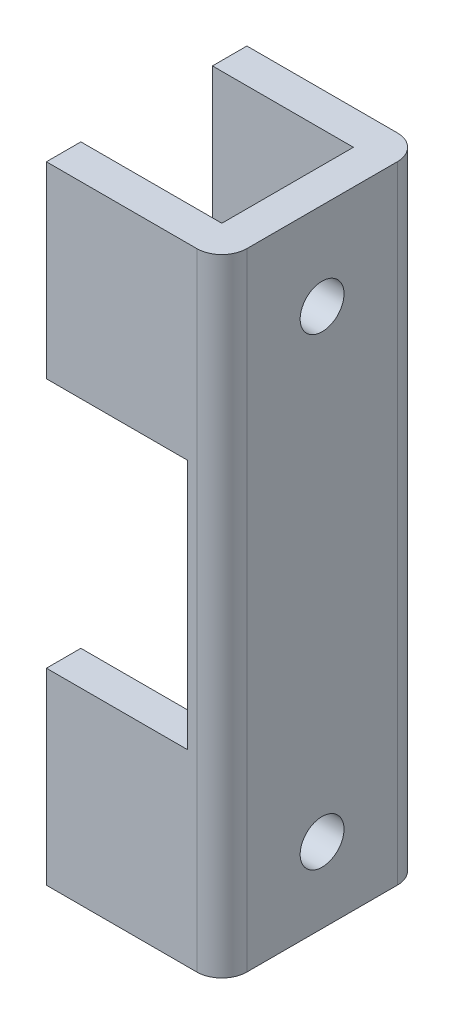
ISO-10303-21;
HEADER;
FILE_DESCRIPTION(('STEP AP214'),'2;1');
FILE_NAME('part.step','',(''),(''),'','','');
FILE_SCHEMA(('AUTOMOTIVE_DESIGN { 1 0 10303 214 1 1 1 1 }'));
ENDSEC;
DATA;
#1=APPLICATION_CONTEXT('core data for automotive mechanical design processes');
#2=APPLICATION_PROTOCOL_DEFINITION('international standard','automotive_design',2000,#1);
#3=PRODUCT_CONTEXT('',#1,'mechanical');
#4=PRODUCT('Part','Part','',(#3));
#5=PRODUCT_RELATED_PRODUCT_CATEGORY('part','',(#4));
#6=PRODUCT_DEFINITION_FORMATION('','',#4);
#7=PRODUCT_DEFINITION_CONTEXT('part definition',#1,'design');
#8=PRODUCT_DEFINITION('design','',#6,#7);
#9=PRODUCT_DEFINITION_SHAPE('','',#8);
#10=(LENGTH_UNIT() NAMED_UNIT(*) SI_UNIT(.MILLI.,.METRE.));
#11=(NAMED_UNIT(*) PLANE_ANGLE_UNIT() SI_UNIT($,.RADIAN.));
#12=(NAMED_UNIT(*) SI_UNIT($,.STERADIAN.) SOLID_ANGLE_UNIT());
#13=UNCERTAINTY_MEASURE_WITH_UNIT(LENGTH_MEASURE(1.E-05),#10,'distance_accuracy_value','');
#14=(GEOMETRIC_REPRESENTATION_CONTEXT(3) GLOBAL_UNCERTAINTY_ASSIGNED_CONTEXT((#13)) GLOBAL_UNIT_ASSIGNED_CONTEXT((#10,
#11,#12)) REPRESENTATION_CONTEXT('',''));
#15=CARTESIAN_POINT('',(0.,0.,0.));
#16=DIRECTION('',(0.,0.,1.));
#17=DIRECTION('',(1.,0.,0.));
#18=AXIS2_PLACEMENT_3D('',#15,#16,#17);
#19=CARTESIAN_POINT('',(-8.95384615384615,50.,-10.5076923076923));
#20=DIRECTION('',(1.,0.,0.));
#21=DIRECTION('',(0.,0.,-1.));
#22=AXIS2_PLACEMENT_3D('',#19,#20,#21);
#23=PLANE('',#22);
#24=DIRECTION('',(0.,1.,0.));
#25=VECTOR('',#24,1.);
#26=CARTESIAN_POINT('',(-8.95384615384615,0.,2.74230769230769));
#27=LINE('',#26,#25);
#28=CARTESIAN_POINT('',(-8.95384615384616,35.,2.74230769230769));
#29=VERTEX_POINT('',#28);
#30=CARTESIAN_POINT('',(-8.95384615384615,50.,2.74230769230769));
#31=VERTEX_POINT('',#30);
#32=EDGE_CURVE('E234',#29,#31,#27,.T.);
#33=ORIENTED_EDGE('',*,*,#32,.F.);
#34=DIRECTION('',(0.,0.,-1.));
#35=VECTOR('',#34,1.);
#36=CARTESIAN_POINT('',(-8.95384615384616,35.,5.49230769230769));
#37=LINE('',#36,#35);
#38=CARTESIAN_POINT('',(-8.95384615384616,35.,5.49230769230769));
#39=VERTEX_POINT('',#38);
#40=EDGE_CURVE('E203',#39,#29,#37,.T.);
#41=ORIENTED_EDGE('',*,*,#40,.F.);
#42=DIRECTION('',(0.,-1.,0.));
#43=VECTOR('',#42,1.);
#44=CARTESIAN_POINT('',(-8.95384615384615,50.,5.49230769230769));
#45=LINE('',#44,#43);
#46=CARTESIAN_POINT('',(-8.95384615384615,50.,5.49230769230769));
#47=VERTEX_POINT('',#46);
#48=EDGE_CURVE('E187',#47,#39,#45,.T.);
#49=ORIENTED_EDGE('',*,*,#48,.F.);
#50=DIRECTION('',(0.,0.,1.));
#51=VECTOR('',#50,1.);
#52=CARTESIAN_POINT('',(-8.95384615384615,50.,-10.5076923076923));
#53=LINE('',#52,#51);
#54=EDGE_CURVE('E276',#31,#47,#53,.T.);
#55=ORIENTED_EDGE('',*,*,#54,.F.);
#56=EDGE_LOOP('',(#33,#41,#49,#55));
#57=FACE_BOUND('',#56,.T.);
#58=ADVANCED_FACE('F38',(#57),#23,.F.);
#59=DIRECTION('',(0.,-1.,0.));
#60=VECTOR('',#59,1.);
#61=CARTESIAN_POINT('',(-8.95384615384615,50.,-10.5076923076923));
#62=LINE('',#61,#60);
#63=CARTESIAN_POINT('',(-8.95384615384615,50.,-10.5076923076923));
#64=VERTEX_POINT('',#63);
#65=CARTESIAN_POINT('',(-8.95384615384615,35.,-10.5076923076923));
#66=VERTEX_POINT('',#65);
#67=EDGE_CURVE('E333',#64,#66,#62,.T.);
#68=ORIENTED_EDGE('',*,*,#67,.T.);
#69=CARTESIAN_POINT('',(-8.95384615384615,35.,-7.75769230769231));
#70=VERTEX_POINT('',#69);
#71=EDGE_CURVE('E207',#70,#66,#37,.T.);
#72=ORIENTED_EDGE('',*,*,#71,.F.);
#73=DIRECTION('',(0.,1.,0.));
#74=VECTOR('',#73,1.);
#75=CARTESIAN_POINT('',(-8.95384615384615,0.,-7.75769230769231));
#76=LINE('',#75,#74);
#77=CARTESIAN_POINT('',(-8.95384615384615,50.,-7.75769230769231));
#78=VERTEX_POINT('',#77);
#79=EDGE_CURVE('E239',#70,#78,#76,.T.);
#80=ORIENTED_EDGE('',*,*,#79,.T.);
#81=EDGE_CURVE('E278',#64,#78,#53,.T.);
#82=ORIENTED_EDGE('',*,*,#81,.F.);
#83=EDGE_LOOP('',(#68,#72,#80,#82));
#84=FACE_BOUND('',#83,.T.);
#85=ADVANCED_FACE('F416',(#84),#23,.F.);
#86=CARTESIAN_POINT('',(-6.20384615384615,0.,2.74230769230769));
#87=DIRECTION('',(0.,0.,1.));
#88=DIRECTION('',(1.,0.,0.));
#89=AXIS2_PLACEMENT_3D('',#86,#87,#88);
#90=PLANE('',#89);
#91=DIRECTION('',(0.,1.,0.));
#92=VECTOR('',#91,1.);
#93=CARTESIAN_POINT('',(2.29615384615385,0.,2.74230769230769));
#94=LINE('',#93,#92);
#95=CARTESIAN_POINT('',(2.29615384615385,35.,2.74230769230769));
#96=VERTEX_POINT('',#95);
#97=CARTESIAN_POINT('',(2.29615384615385,50.,2.74230769230769));
#98=VERTEX_POINT('',#97);
#99=EDGE_CURVE('E267',#96,#98,#94,.T.);
#100=ORIENTED_EDGE('',*,*,#99,.F.);
#101=DIRECTION('',(-1.,0.,0.));
#102=VECTOR('',#101,1.);
#103=CARTESIAN_POINT('',(-6.20384615384615,35.,2.74230769230769));
#104=LINE('',#103,#102);
#105=EDGE_CURVE('E166',#96,#29,#104,.T.);
#106=ORIENTED_EDGE('',*,*,#105,.T.);
#107=ORIENTED_EDGE('',*,*,#32,.T.);
#108=DIRECTION('',(1.,0.,0.));
#109=VECTOR('',#108,1.);
#110=CARTESIAN_POINT('',(-6.20384615384615,50.,2.74230769230769));
#111=LINE('',#110,#109);
#112=EDGE_CURVE('E245',#31,#98,#111,.T.);
#113=ORIENTED_EDGE('',*,*,#112,.T.);
#114=EDGE_LOOP('',(#100,#106,#107,#113));
#115=FACE_BOUND('',#114,.T.);
#116=ADVANCED_FACE('F422',(#115),#90,.F.);
#117=CARTESIAN_POINT('',(2.29615384615385,0.,-7.75769230769231));
#118=DIRECTION('',(0.,0.,-1.));
#119=DIRECTION('',(-1.,0.,0.));
#120=AXIS2_PLACEMENT_3D('',#117,#118,#119);
#121=PLANE('',#120);
#122=ORIENTED_EDGE('',*,*,#79,.F.);
#123=DIRECTION('',(1.,0.,0.));
#124=VECTOR('',#123,1.);
#125=CARTESIAN_POINT('',(2.29615384615385,35.,-7.75769230769231));
#126=LINE('',#125,#124);
#127=CARTESIAN_POINT('',(2.29615384615385,35.,-7.75769230769231));
#128=VERTEX_POINT('',#127);
#129=EDGE_CURVE('E11',#70,#128,#126,.T.);
#130=ORIENTED_EDGE('',*,*,#129,.T.);
#131=DIRECTION('',(0.,1.,0.));
#132=VECTOR('',#131,1.);
#133=CARTESIAN_POINT('',(2.29615384615385,0.,-7.75769230769231));
#134=LINE('',#133,#132);
#135=CARTESIAN_POINT('',(2.29615384615385,50.,-7.75769230769231));
#136=VERTEX_POINT('',#135);
#137=EDGE_CURVE('E252',#128,#136,#134,.T.);
#138=ORIENTED_EDGE('',*,*,#137,.T.);
#139=DIRECTION('',(-1.,0.,0.));
#140=VECTOR('',#139,1.);
#141=CARTESIAN_POINT('',(2.29615384615385,50.,-7.75769230769231));
#142=LINE('',#141,#140);
#143=EDGE_CURVE('E256',#136,#78,#142,.T.);
#144=ORIENTED_EDGE('',*,*,#143,.T.);
#145=EDGE_LOOP('',(#122,#130,#138,#144));
#146=FACE_BOUND('',#145,.T.);
#147=ADVANCED_FACE('F433',(#146),#121,.F.);
#148=CARTESIAN_POINT('',(-8.95384615384616,15.,5.49230769230769));
#149=VERTEX_POINT('',#148);
#150=CARTESIAN_POINT('',(-8.95384615384615,0.,5.49230769230769));
#151=VERTEX_POINT('',#150);
#152=EDGE_CURVE('E329',#149,#151,#45,.T.);
#153=ORIENTED_EDGE('',*,*,#152,.F.);
#154=DIRECTION('',(0.,0.,-1.));
#155=VECTOR('',#154,1.);
#156=CARTESIAN_POINT('',(-8.95384615384616,15.,5.49230769230769));
#157=LINE('',#156,#155);
#158=CARTESIAN_POINT('',(-8.95384615384616,15.,2.74230769230769));
#159=VERTEX_POINT('',#158);
#160=EDGE_CURVE('E208',#149,#159,#157,.T.);
#161=ORIENTED_EDGE('',*,*,#160,.T.);
#162=CARTESIAN_POINT('',(-8.95384615384615,0.,2.74230769230769));
#163=VERTEX_POINT('',#162);
#164=EDGE_CURVE('E229',#163,#159,#27,.T.);
#165=ORIENTED_EDGE('',*,*,#164,.F.);
#166=DIRECTION('',(0.,0.,1.));
#167=VECTOR('',#166,1.);
#168=CARTESIAN_POINT('',(-8.95384615384615,0.,-10.5076923076923));
#169=LINE('',#168,#167);
#170=EDGE_CURVE('E298',#163,#151,#169,.T.);
#171=ORIENTED_EDGE('',*,*,#170,.T.);
#172=EDGE_LOOP('',(#153,#161,#165,#171));
#173=FACE_BOUND('',#172,.T.);
#174=ADVANCED_FACE('F424',(#173),#23,.F.);
#175=CARTESIAN_POINT('',(-8.95384615384615,50.,-10.5076923076923));
#176=DIRECTION('',(0.,0.,1.));
#177=DIRECTION('',(1.,0.,0.));
#178=AXIS2_PLACEMENT_3D('',#175,#176,#177);
#179=PLANE('',#178);
#180=DIRECTION('',(0.,-1.,0.));
#181=VECTOR('',#180,1.);
#182=CARTESIAN_POINT('',(2.29615384615385,15.,-10.5076923076923));
#183=LINE('',#182,#181);
#184=CARTESIAN_POINT('',(2.29615384615385,35.,-10.5076923076923));
#185=VERTEX_POINT('',#184);
#186=CARTESIAN_POINT('',(2.29615384615385,15.,-10.5076923076923));
#187=VERTEX_POINT('',#186);
#188=EDGE_CURVE('E192',#185,#187,#183,.T.);
#189=ORIENTED_EDGE('',*,*,#188,.F.);
#190=DIRECTION('',(1.,0.,0.));
#191=VECTOR('',#190,1.);
#192=CARTESIAN_POINT('',(2.29615384615385,35.,-10.5076923076923));
#193=LINE('',#192,#191);
#194=EDGE_CURVE('E197',#66,#185,#193,.T.);
#195=ORIENTED_EDGE('',*,*,#194,.F.);
#196=ORIENTED_EDGE('',*,*,#67,.F.);
#197=DIRECTION('',(-1.,0.,0.));
#198=VECTOR('',#197,1.);
#199=CARTESIAN_POINT('',(-8.95384615384615,50.,-10.5076923076923));
#200=LINE('',#199,#198);
#201=CARTESIAN_POINT('',(3.04615384615385,50.,-10.5076923076923));
#202=VERTEX_POINT('',#201);
#203=EDGE_CURVE('E272',#202,#64,#200,.T.);
#204=ORIENTED_EDGE('',*,*,#203,.F.);
#205=DIRECTION('',(0.,-1.,0.));
#206=VECTOR('',#205,1.);
#207=CARTESIAN_POINT('',(3.04615384615385,50.,-10.5076923076923));
#208=LINE('',#207,#206);
#209=CARTESIAN_POINT('',(3.04615384615385,0.,-10.5076923076923));
#210=VERTEX_POINT('',#209);
#211=EDGE_CURVE('E294',#202,#210,#208,.T.);
#212=ORIENTED_EDGE('',*,*,#211,.T.);
#213=DIRECTION('',(-1.,0.,0.));
#214=VECTOR('',#213,1.);
#215=CARTESIAN_POINT('',(-8.95384615384615,0.,-10.5076923076923));
#216=LINE('',#215,#214);
#217=CARTESIAN_POINT('',(-8.95384615384615,0.,-10.5076923076923));
#218=VERTEX_POINT('',#217);
#219=EDGE_CURVE('E266',#210,#218,#216,.T.);
#220=ORIENTED_EDGE('',*,*,#219,.T.);
#221=CARTESIAN_POINT('',(-8.95384615384615,15.,-10.5076923076923));
#222=VERTEX_POINT('',#221);
#223=EDGE_CURVE('E332',#222,#218,#62,.T.);
#224=ORIENTED_EDGE('',*,*,#223,.F.);
#225=DIRECTION('',(-1.,0.,0.));
#226=VECTOR('',#225,1.);
#227=CARTESIAN_POINT('',(-8.95384615384615,15.,-10.5076923076923));
#228=LINE('',#227,#226);
#229=EDGE_CURVE('E189',#187,#222,#228,.T.);
#230=ORIENTED_EDGE('',*,*,#229,.F.);
#231=EDGE_LOOP('',(#189,#195,#196,#204,#212,#220,#224,#230));
#232=FACE_BOUND('',#231,.T.);
#233=ADVANCED_FACE('F40',(#232),#179,.F.);
#234=CARTESIAN_POINT('',(-8.95384615384615,0.,-7.75769230769231));
#235=VERTEX_POINT('',#234);
#236=CARTESIAN_POINT('',(-8.95384615384615,15.,-7.75769230769231));
#237=VERTEX_POINT('',#236);
#238=EDGE_CURVE('E235',#235,#237,#76,.T.);
#239=ORIENTED_EDGE('',*,*,#238,.T.);
#240=EDGE_CURVE('E212',#237,#222,#157,.T.);
#241=ORIENTED_EDGE('',*,*,#240,.T.);
#242=ORIENTED_EDGE('',*,*,#223,.T.);
#243=EDGE_CURVE('E299',#218,#235,#169,.T.);
#244=ORIENTED_EDGE('',*,*,#243,.T.);
#245=EDGE_LOOP('',(#239,#241,#242,#244));
#246=FACE_BOUND('',#245,.T.);
#247=ADVANCED_FACE('F352',(#246),#23,.F.);
#248=CARTESIAN_POINT('',(-8.95384615384615,50.,5.49230769230769));
#249=DIRECTION('',(0.,0.,-1.));
#250=DIRECTION('',(-1.,0.,0.));
#251=AXIS2_PLACEMENT_3D('',#248,#249,#250);
#252=PLANE('',#251);
#253=ORIENTED_EDGE('',*,*,#48,.T.);
#254=DIRECTION('',(1.,0.,0.));
#255=VECTOR('',#254,1.);
#256=CARTESIAN_POINT('',(2.29615384615384,35.,5.49230769230769));
#257=LINE('',#256,#255);
#258=CARTESIAN_POINT('',(2.29615384615384,35.,5.49230769230769));
#259=VERTEX_POINT('',#258);
#260=EDGE_CURVE('E163',#39,#259,#257,.T.);
#261=ORIENTED_EDGE('',*,*,#260,.T.);
#262=DIRECTION('',(0.,-1.,0.));
#263=VECTOR('',#262,1.);
#264=CARTESIAN_POINT('',(2.29615384615384,15.,5.49230769230769));
#265=LINE('',#264,#263);
#266=CARTESIAN_POINT('',(2.29615384615384,15.,5.49230769230769));
#267=VERTEX_POINT('',#266);
#268=EDGE_CURVE('E172',#259,#267,#265,.T.);
#269=ORIENTED_EDGE('',*,*,#268,.T.);
#270=DIRECTION('',(-1.,0.,0.));
#271=VECTOR('',#270,1.);
#272=CARTESIAN_POINT('',(-8.95384615384616,15.,5.49230769230769));
#273=LINE('',#272,#271);
#274=EDGE_CURVE('E181',#267,#149,#273,.T.);
#275=ORIENTED_EDGE('',*,*,#274,.T.);
#276=ORIENTED_EDGE('',*,*,#152,.T.);
#277=DIRECTION('',(1.,0.,0.));
#278=VECTOR('',#277,1.);
#279=CARTESIAN_POINT('',(-8.95384615384615,0.,5.49230769230769));
#280=LINE('',#279,#278);
#281=CARTESIAN_POINT('',(3.04615384615385,0.,5.49230769230769));
#282=VERTEX_POINT('',#281);
#283=EDGE_CURVE('E303',#151,#282,#280,.T.);
#284=ORIENTED_EDGE('',*,*,#283,.T.);
#285=DIRECTION('',(0.,-1.,0.));
#286=VECTOR('',#285,1.);
#287=CARTESIAN_POINT('',(3.04615384615385,50.,5.49230769230769));
#288=LINE('',#287,#286);
#289=CARTESIAN_POINT('',(3.04615384615385,50.,5.49230769230769));
#290=VERTEX_POINT('',#289);
#291=EDGE_CURVE('E325',#290,#282,#288,.T.);
#292=ORIENTED_EDGE('',*,*,#291,.F.);
#293=DIRECTION('',(1.,0.,0.));
#294=VECTOR('',#293,1.);
#295=CARTESIAN_POINT('',(-8.95384615384615,50.,5.49230769230769));
#296=LINE('',#295,#294);
#297=EDGE_CURVE('E282',#47,#290,#296,.T.);
#298=ORIENTED_EDGE('',*,*,#297,.F.);
#299=EDGE_LOOP('',(#253,#261,#269,#275,#276,#284,#292,#298));
#300=FACE_BOUND('',#299,.T.);
#301=ADVANCED_FACE('F184',(#300),#252,.F.);
#302=CARTESIAN_POINT('',(3.04615384615385,50.,3.49230769230769));
#303=DIRECTION('',(0.,-1.,0.));
#304=DIRECTION('',(0.,0.,-1.));
#305=AXIS2_PLACEMENT_3D('',#302,#303,#304);
#306=CYLINDRICAL_SURFACE('',#305,2.);
#307=CARTESIAN_POINT('',(3.04615384615385,0.,3.49230769230769));
#308=DIRECTION('',(0.,1.,0.));
#309=DIRECTION('',(0.,0.,1.));
#310=AXIS2_PLACEMENT_3D('',#307,#308,#309);
#311=CIRCLE('',#310,2.);
#312=CARTESIAN_POINT('',(5.04615384615385,0.,3.49230769230769));
#313=VERTEX_POINT('',#312);
#314=EDGE_CURVE('E306',#282,#313,#311,.T.);
#315=ORIENTED_EDGE('',*,*,#314,.T.);
#316=DIRECTION('',(0.,-1.,0.));
#317=VECTOR('',#316,1.);
#318=CARTESIAN_POINT('',(5.04615384615385,50.,3.49230769230769));
#319=LINE('',#318,#317);
#320=CARTESIAN_POINT('',(5.04615384615385,50.,3.49230769230769));
#321=VERTEX_POINT('',#320);
#322=EDGE_CURVE('E321',#321,#313,#319,.T.);
#323=ORIENTED_EDGE('',*,*,#322,.F.);
#324=CARTESIAN_POINT('',(3.04615384615385,50.,3.49230769230769));
#325=DIRECTION('',(0.,1.,0.));
#326=DIRECTION('',(0.,0.,1.));
#327=AXIS2_PLACEMENT_3D('',#324,#325,#326);
#328=CIRCLE('',#327,2.);
#329=EDGE_CURVE('E285',#290,#321,#328,.T.);
#330=ORIENTED_EDGE('',*,*,#329,.F.);
#331=ORIENTED_EDGE('',*,*,#291,.T.);
#332=EDGE_LOOP('',(#315,#323,#330,#331));
#333=FACE_BOUND('',#332,.T.);
#334=ADVANCED_FACE('F379',(#333),#306,.T.);
#335=CARTESIAN_POINT('',(5.04615384615385,50.,-8.50769230769231));
#336=DIRECTION('',(-1.,0.,0.));
#337=DIRECTION('',(0.,0.,1.));
#338=AXIS2_PLACEMENT_3D('',#335,#336,#337);
#339=PLANE('',#338);
#340=CARTESIAN_POINT('',(5.04615384615385,43.,-2.50769230769231));
#341=DIRECTION('',(1.,0.,0.));
#342=DIRECTION('',(0.,0.,-1.));
#343=AXIS2_PLACEMENT_3D('',#340,#341,#342);
#344=CIRCLE('',#343,1.75);
#345=CARTESIAN_POINT('',(5.04615384615385,43.,-4.25769230769231));
#346=VERTEX_POINT('',#345);
#347=EDGE_CURVE('E221',#346,#346,#344,.T.);
#348=ORIENTED_EDGE('',*,*,#347,.F.);
#349=EDGE_LOOP('',(#348));
#350=FACE_BOUND('',#349,.T.);
#351=CARTESIAN_POINT('',(5.04615384615385,6.00000000000001,-2.50769230769231));
#352=DIRECTION('',(1.,0.,0.));
#353=DIRECTION('',(0.,0.,-1.));
#354=AXIS2_PLACEMENT_3D('',#351,#352,#353);
#355=CIRCLE('',#354,1.75);
#356=CARTESIAN_POINT('',(5.04615384615385,6.00000000000001,-4.25769230769231));
#357=VERTEX_POINT('',#356);
#358=EDGE_CURVE('E220',#357,#357,#355,.T.);
#359=ORIENTED_EDGE('',*,*,#358,.F.);
#360=EDGE_LOOP('',(#359));
#361=FACE_BOUND('',#360,.T.);
#362=DIRECTION('',(0.,0.,-1.));
#363=VECTOR('',#362,1.);
#364=CARTESIAN_POINT('',(5.04615384615385,0.,-8.50769230769231));
#365=LINE('',#364,#363);
#366=CARTESIAN_POINT('',(5.04615384615385,0.,-8.50769230769231));
#367=VERTEX_POINT('',#366);
#368=EDGE_CURVE('E309',#313,#367,#365,.T.);
#369=ORIENTED_EDGE('',*,*,#368,.T.);
#370=DIRECTION('',(0.,-1.,0.));
#371=VECTOR('',#370,1.);
#372=CARTESIAN_POINT('',(5.04615384615385,50.,-8.50769230769231));
#373=LINE('',#372,#371);
#374=CARTESIAN_POINT('',(5.04615384615385,50.,-8.50769230769231));
#375=VERTEX_POINT('',#374);
#376=EDGE_CURVE('E317',#375,#367,#373,.T.);
#377=ORIENTED_EDGE('',*,*,#376,.F.);
#378=DIRECTION('',(0.,0.,-1.));
#379=VECTOR('',#378,1.);
#380=CARTESIAN_POINT('',(5.04615384615385,50.,-8.50769230769231));
#381=LINE('',#380,#379);
#382=EDGE_CURVE('E288',#321,#375,#381,.T.);
#383=ORIENTED_EDGE('',*,*,#382,.F.);
#384=ORIENTED_EDGE('',*,*,#322,.T.);
#385=EDGE_LOOP('',(#369,#377,#383,#384));
#386=FACE_BOUND('',#385,.T.);
#387=ADVANCED_FACE('F374',(#350,#361,#386),#339,.F.);
#388=CARTESIAN_POINT('',(3.04615384615385,50.,-8.50769230769231));
#389=DIRECTION('',(0.,-1.,0.));
#390=DIRECTION('',(0.,0.,-1.));
#391=AXIS2_PLACEMENT_3D('',#388,#389,#390);
#392=CYLINDRICAL_SURFACE('',#391,2.);
#393=CARTESIAN_POINT('',(3.04615384615385,0.,-8.50769230769231));
#394=DIRECTION('',(0.,1.,0.));
#395=DIRECTION('',(0.,0.,-1.));
#396=AXIS2_PLACEMENT_3D('',#393,#394,#395);
#397=CIRCLE('',#396,2.);
#398=EDGE_CURVE('E277',#367,#210,#397,.T.);
#399=ORIENTED_EDGE('',*,*,#398,.T.);
#400=ORIENTED_EDGE('',*,*,#211,.F.);
#401=CARTESIAN_POINT('',(3.04615384615385,50.,-8.50769230769231));
#402=DIRECTION('',(0.,1.,0.));
#403=DIRECTION('',(0.,0.,-1.));
#404=AXIS2_PLACEMENT_3D('',#401,#402,#403);
#405=CIRCLE('',#404,2.);
#406=EDGE_CURVE('E291',#375,#202,#405,.T.);
#407=ORIENTED_EDGE('',*,*,#406,.F.);
#408=ORIENTED_EDGE('',*,*,#376,.T.);
#409=EDGE_LOOP('',(#399,#400,#407,#408));
#410=FACE_BOUND('',#409,.T.);
#411=ADVANCED_FACE('F368',(#410),#392,.T.);
#412=CARTESIAN_POINT('',(3.04615384615385,50.,-8.50769230769231));
#413=DIRECTION('',(0.,-1.,0.));
#414=DIRECTION('',(0.,0.,-1.));
#415=AXIS2_PLACEMENT_3D('',#412,#413,#414);
#416=PLANE('',#415);
#417=ORIENTED_EDGE('',*,*,#112,.F.);
#418=ORIENTED_EDGE('',*,*,#54,.T.);
#419=ORIENTED_EDGE('',*,*,#297,.T.);
#420=ORIENTED_EDGE('',*,*,#329,.T.);
#421=ORIENTED_EDGE('',*,*,#382,.T.);
#422=ORIENTED_EDGE('',*,*,#406,.T.);
#423=ORIENTED_EDGE('',*,*,#203,.T.);
#424=ORIENTED_EDGE('',*,*,#81,.T.);
#425=ORIENTED_EDGE('',*,*,#143,.F.);
#426=DIRECTION('',(0.,0.,-1.));
#427=VECTOR('',#426,1.);
#428=CARTESIAN_POINT('',(2.29615384615385,50.,2.74230769230769));
#429=LINE('',#428,#427);
#430=EDGE_CURVE('E233',#98,#136,#429,.T.);
#431=ORIENTED_EDGE('',*,*,#430,.F.);
#432=EDGE_LOOP('',(#417,#418,#419,#420,#421,#422,#423,#424,#425,#431));
#433=FACE_BOUND('',#432,.T.);
#434=ADVANCED_FACE('F445',(#433),#416,.F.);
#435=CARTESIAN_POINT('',(3.04615384615385,0.,-8.50769230769231));
#436=DIRECTION('',(0.,-1.,0.));
#437=DIRECTION('',(0.,0.,-1.));
#438=AXIS2_PLACEMENT_3D('',#435,#436,#437);
#439=PLANE('',#438);
#440=ORIENTED_EDGE('',*,*,#170,.F.);
#441=DIRECTION('',(1.,0.,0.));
#442=VECTOR('',#441,1.);
#443=CARTESIAN_POINT('',(-6.20384615384615,0.,2.74230769230769));
#444=LINE('',#443,#442);
#445=CARTESIAN_POINT('',(2.29615384615385,0.,2.74230769230769));
#446=VERTEX_POINT('',#445);
#447=EDGE_CURVE('E248',#163,#446,#444,.T.);
#448=ORIENTED_EDGE('',*,*,#447,.T.);
#449=DIRECTION('',(0.,0.,-1.));
#450=VECTOR('',#449,1.);
#451=CARTESIAN_POINT('',(2.29615384615385,0.,2.74230769230769));
#452=LINE('',#451,#450);
#453=CARTESIAN_POINT('',(2.29615384615385,0.,-7.75769230769231));
#454=VERTEX_POINT('',#453);
#455=EDGE_CURVE('E240',#446,#454,#452,.T.);
#456=ORIENTED_EDGE('',*,*,#455,.T.);
#457=DIRECTION('',(-1.,0.,0.));
#458=VECTOR('',#457,1.);
#459=CARTESIAN_POINT('',(2.29615384615385,0.,-7.75769230769231));
#460=LINE('',#459,#458);
#461=EDGE_CURVE('E244',#454,#235,#460,.T.);
#462=ORIENTED_EDGE('',*,*,#461,.T.);
#463=ORIENTED_EDGE('',*,*,#243,.F.);
#464=ORIENTED_EDGE('',*,*,#219,.F.);
#465=ORIENTED_EDGE('',*,*,#398,.F.);
#466=ORIENTED_EDGE('',*,*,#368,.F.);
#467=ORIENTED_EDGE('',*,*,#314,.F.);
#468=ORIENTED_EDGE('',*,*,#283,.F.);
#469=EDGE_LOOP('',(#440,#448,#456,#462,#463,#464,#465,#466,#467,#468));
#470=FACE_BOUND('',#469,.T.);
#471=ADVANCED_FACE('F358',(#470),#439,.T.);
#472=CARTESIAN_POINT('',(2.29615384615385,0.,2.74230769230769));
#473=DIRECTION('',(1.,0.,0.));
#474=DIRECTION('',(0.,0.,-1.));
#475=AXIS2_PLACEMENT_3D('',#472,#473,#474);
#476=PLANE('',#475);
#477=CARTESIAN_POINT('',(2.29615384615385,6.00000000000001,-2.50769230769231));
#478=DIRECTION('',(1.,0.,0.));
#479=DIRECTION('',(0.,0.,-1.));
#480=AXIS2_PLACEMENT_3D('',#477,#478,#479);
#481=CIRCLE('',#480,1.75);
#482=CARTESIAN_POINT('',(2.29615384615385,6.00000000000001,-4.25769230769231));
#483=VERTEX_POINT('',#482);
#484=EDGE_CURVE('E225',#483,#483,#481,.T.);
#485=ORIENTED_EDGE('',*,*,#484,.T.);
#486=EDGE_LOOP('',(#485));
#487=FACE_BOUND('',#486,.T.);
#488=CARTESIAN_POINT('',(2.29615384615384,15.,2.74230769230769));
#489=VERTEX_POINT('',#488);
#490=EDGE_CURVE('E263',#446,#489,#94,.T.);
#491=ORIENTED_EDGE('',*,*,#490,.T.);
#492=DIRECTION('',(0.,0.,-1.));
#493=VECTOR('',#492,1.);
#494=CARTESIAN_POINT('',(2.29615384615384,15.,5.49230769230769));
#495=LINE('',#494,#493);
#496=EDGE_CURVE('E176',#267,#489,#495,.T.);
#497=ORIENTED_EDGE('',*,*,#496,.F.);
#498=ORIENTED_EDGE('',*,*,#268,.F.);
#499=DIRECTION('',(0.,0.,-1.));
#500=VECTOR('',#499,1.);
#501=CARTESIAN_POINT('',(2.29615384615384,35.,5.49230769230769));
#502=LINE('',#501,#500);
#503=EDGE_CURVE('E54',#259,#96,#502,.T.);
#504=ORIENTED_EDGE('',*,*,#503,.T.);
#505=ORIENTED_EDGE('',*,*,#99,.T.);
#506=ORIENTED_EDGE('',*,*,#430,.T.);
#507=ORIENTED_EDGE('',*,*,#137,.F.);
#508=EDGE_CURVE('E169',#128,#185,#502,.T.);
#509=ORIENTED_EDGE('',*,*,#508,.T.);
#510=ORIENTED_EDGE('',*,*,#188,.T.);
#511=CARTESIAN_POINT('',(2.29615384615385,15.,-7.75769230769231));
#512=VERTEX_POINT('',#511);
#513=EDGE_CURVE('E61',#512,#187,#495,.T.);
#514=ORIENTED_EDGE('',*,*,#513,.F.);
#515=EDGE_CURVE('E268',#454,#512,#134,.T.);
#516=ORIENTED_EDGE('',*,*,#515,.F.);
#517=ORIENTED_EDGE('',*,*,#455,.F.);
#518=EDGE_LOOP('',(#491,#497,#498,#504,#505,#506,#507,#509,#510,#514,#516,#517));
#519=FACE_BOUND('',#518,.T.);
#520=CARTESIAN_POINT('',(2.29615384615385,43.,-2.50769230769231));
#521=DIRECTION('',(1.,0.,0.));
#522=DIRECTION('',(0.,0.,-1.));
#523=AXIS2_PLACEMENT_3D('',#520,#521,#522);
#524=CIRCLE('',#523,1.75);
#525=CARTESIAN_POINT('',(2.29615384615385,43.,-4.25769230769231));
#526=VERTEX_POINT('',#525);
#527=EDGE_CURVE('E340',#526,#526,#524,.T.);
#528=ORIENTED_EDGE('',*,*,#527,.T.);
#529=EDGE_LOOP('',(#528));
#530=FACE_BOUND('',#529,.T.);
#531=ADVANCED_FACE('F174',(#487,#519,#530),#476,.F.);
#532=ORIENTED_EDGE('',*,*,#164,.T.);
#533=DIRECTION('',(1.,0.,0.));
#534=VECTOR('',#533,1.);
#535=CARTESIAN_POINT('',(-6.20384615384615,15.,2.74230769230769));
#536=LINE('',#535,#534);
#537=EDGE_CURVE('E206',#159,#489,#536,.T.);
#538=ORIENTED_EDGE('',*,*,#537,.T.);
#539=ORIENTED_EDGE('',*,*,#490,.F.);
#540=ORIENTED_EDGE('',*,*,#447,.F.);
#541=EDGE_LOOP('',(#532,#538,#539,#540));
#542=FACE_BOUND('',#541,.T.);
#543=ADVANCED_FACE('F452',(#542),#90,.F.);
#544=ORIENTED_EDGE('',*,*,#515,.T.);
#545=DIRECTION('',(-1.,0.,0.));
#546=VECTOR('',#545,1.);
#547=CARTESIAN_POINT('',(2.29615384615385,15.,-7.75769230769231));
#548=LINE('',#547,#546);
#549=EDGE_CURVE('E47',#512,#237,#548,.T.);
#550=ORIENTED_EDGE('',*,*,#549,.T.);
#551=ORIENTED_EDGE('',*,*,#238,.F.);
#552=ORIENTED_EDGE('',*,*,#461,.F.);
#553=EDGE_LOOP('',(#544,#550,#551,#552));
#554=FACE_BOUND('',#553,.T.);
#555=ADVANCED_FACE('F347',(#554),#121,.F.);
#556=CARTESIAN_POINT('',(-8.95384615384616,6.00000000000001,-2.5076923076923));
#557=DIRECTION('',(1.,0.,0.));
#558=DIRECTION('',(0.,0.,-1.));
#559=AXIS2_PLACEMENT_3D('',#556,#557,#558);
#560=CYLINDRICAL_SURFACE('',#559,1.75);
#561=ORIENTED_EDGE('',*,*,#358,.T.);
#562=EDGE_LOOP('',(#561));
#563=FACE_BOUND('',#562,.T.);
#564=ORIENTED_EDGE('',*,*,#484,.F.);
#565=EDGE_LOOP('',(#564));
#566=FACE_BOUND('',#565,.T.);
#567=ADVANCED_FACE('F410',(#563,#566),#560,.F.);
#568=CARTESIAN_POINT('',(-8.95384615384616,43.,-2.5076923076923));
#569=DIRECTION('',(1.,0.,0.));
#570=DIRECTION('',(0.,0.,-1.));
#571=AXIS2_PLACEMENT_3D('',#568,#569,#570);
#572=CYLINDRICAL_SURFACE('',#571,1.75);
#573=ORIENTED_EDGE('',*,*,#347,.T.);
#574=EDGE_LOOP('',(#573));
#575=FACE_BOUND('',#574,.T.);
#576=ORIENTED_EDGE('',*,*,#527,.F.);
#577=EDGE_LOOP('',(#576));
#578=FACE_BOUND('',#577,.T.);
#579=ADVANCED_FACE('F401',(#575,#578),#572,.F.);
#580=CARTESIAN_POINT('',(-8.95384615384616,15.,5.49230769230769));
#581=DIRECTION('',(0.,-1.,0.));
#582=DIRECTION('',(1.,0.,0.));
#583=AXIS2_PLACEMENT_3D('',#580,#581,#582);
#584=PLANE('',#583);
#585=ORIENTED_EDGE('',*,*,#513,.T.);
#586=ORIENTED_EDGE('',*,*,#229,.T.);
#587=ORIENTED_EDGE('',*,*,#240,.F.);
#588=ORIENTED_EDGE('',*,*,#549,.F.);
#589=EDGE_LOOP('',(#585,#586,#587,#588));
#590=FACE_BOUND('',#589,.T.);
#591=ADVANCED_FACE('F399',(#590),#584,.F.);
#592=CARTESIAN_POINT('',(2.29615384615384,35.,5.49230769230769));
#593=DIRECTION('',(0.,1.,0.));
#594=DIRECTION('',(0.,0.,1.));
#595=AXIS2_PLACEMENT_3D('',#592,#593,#594);
#596=PLANE('',#595);
#597=ORIENTED_EDGE('',*,*,#71,.T.);
#598=ORIENTED_EDGE('',*,*,#194,.T.);
#599=ORIENTED_EDGE('',*,*,#508,.F.);
#600=ORIENTED_EDGE('',*,*,#129,.F.);
#601=EDGE_LOOP('',(#597,#598,#599,#600));
#602=FACE_BOUND('',#601,.T.);
#603=ADVANCED_FACE('F397',(#602),#596,.F.);
#604=ORIENTED_EDGE('',*,*,#503,.F.);
#605=ORIENTED_EDGE('',*,*,#260,.F.);
#606=ORIENTED_EDGE('',*,*,#40,.T.);
#607=ORIENTED_EDGE('',*,*,#105,.F.);
#608=EDGE_LOOP('',(#604,#605,#606,#607));
#609=FACE_BOUND('',#608,.T.);
#610=ADVANCED_FACE('F161',(#609),#596,.F.);
#611=ORIENTED_EDGE('',*,*,#160,.F.);
#612=ORIENTED_EDGE('',*,*,#274,.F.);
#613=ORIENTED_EDGE('',*,*,#496,.T.);
#614=ORIENTED_EDGE('',*,*,#537,.F.);
#615=EDGE_LOOP('',(#611,#612,#613,#614));
#616=FACE_BOUND('',#615,.T.);
#617=ADVANCED_FACE('F403',(#616),#584,.F.);
#618=CLOSED_SHELL('',(#58,#85,#116,#147,#174,#233,#247,#301,#334,#387,#411,#434,#471,#531,#543,
#555,#567,#579,#591,#603,#610,#617));
#619=MANIFOLD_SOLID_BREP('B2',#618);
#620=ADVANCED_BREP_SHAPE_REPRESENTATION('',(#18,#619),#14);
#621=SHAPE_DEFINITION_REPRESENTATION(#9,#620);
ENDSEC;
END-ISO-10303-21;
